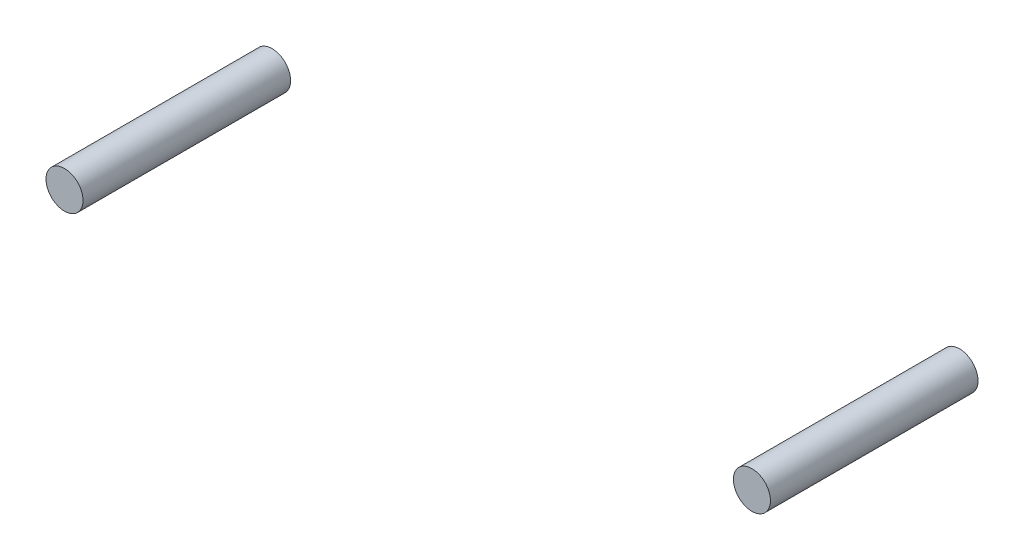
ISO-10303-21;
HEADER;
FILE_DESCRIPTION(('STEP AP214'),'2;1');
FILE_NAME('part.step','',(''),(''),'','','');
FILE_SCHEMA(('AUTOMOTIVE_DESIGN { 1 0 10303 214 1 1 1 1 }'));
ENDSEC;
DATA;
#1=APPLICATION_CONTEXT('core data for automotive mechanical design processes');
#2=APPLICATION_PROTOCOL_DEFINITION('international standard','automotive_design',2000,#1);
#3=PRODUCT_CONTEXT('',#1,'mechanical');
#4=PRODUCT('Part','Part','',(#3));
#5=PRODUCT_RELATED_PRODUCT_CATEGORY('part','',(#4));
#6=PRODUCT_DEFINITION_FORMATION('','',#4);
#7=PRODUCT_DEFINITION_CONTEXT('part definition',#1,'design');
#8=PRODUCT_DEFINITION('design','',#6,#7);
#9=PRODUCT_DEFINITION_SHAPE('','',#8);
#10=(LENGTH_UNIT() NAMED_UNIT(*) SI_UNIT(.MILLI.,.METRE.));
#11=(NAMED_UNIT(*) PLANE_ANGLE_UNIT() SI_UNIT($,.RADIAN.));
#12=(NAMED_UNIT(*) SI_UNIT($,.STERADIAN.) SOLID_ANGLE_UNIT());
#13=UNCERTAINTY_MEASURE_WITH_UNIT(LENGTH_MEASURE(1.E-05),#10,'distance_accuracy_value','');
#14=(GEOMETRIC_REPRESENTATION_CONTEXT(3) GLOBAL_UNCERTAINTY_ASSIGNED_CONTEXT((#13)) GLOBAL_UNIT_ASSIGNED_CONTEXT((#10,
#11,#12)) REPRESENTATION_CONTEXT('',''));
#15=CARTESIAN_POINT('',(0.,0.,0.));
#16=DIRECTION('',(0.,0.,1.));
#17=DIRECTION('',(1.,0.,0.));
#18=AXIS2_PLACEMENT_3D('',#15,#16,#17);
#19=CARTESIAN_POINT('',(0.,0.,48.2981000000003));
#20=DIRECTION('',(0.,0.,1.));
#21=DIRECTION('',(1.,0.,0.));
#22=AXIS2_PLACEMENT_3D('',#19,#20,#21);
#23=PLANE('',#22);
#24=CARTESIAN_POINT('',(-2.36061170610924E-13,-1.04014019619569E-13,48.2981000000003));
#25=DIRECTION('',(0.,0.,1.));
#26=DIRECTION('',(1.,0.,0.));
#27=AXIS2_PLACEMENT_3D('',#24,#25,#26);
#28=CIRCLE('',#27,6.35);
#29=CARTESIAN_POINT('',(6.34999999999976,-1.04014019619569E-13,48.2981000000003));
#30=VERTEX_POINT('',#29);
#31=EDGE_CURVE('E11',#30,#30,#28,.F.);
#32=ORIENTED_EDGE('',*,*,#31,.F.);
#33=EDGE_LOOP('',(#32));
#34=FACE_BOUND('',#33,.T.);
#35=ADVANCED_FACE('F44',(#34),#23,.T.);
#36=CARTESIAN_POINT('',(-1.97182548067331E-13,-1.23453330891366E-13,-22.86));
#37=DIRECTION('',(0.,0.,-1.));
#38=DIRECTION('',(-1.,0.,0.));
#39=AXIS2_PLACEMENT_3D('',#36,#37,#38);
#40=PLANE('',#39);
#41=CARTESIAN_POINT('',(-1.97182548067331E-13,-1.23453330891366E-13,-22.86));
#42=DIRECTION('',(0.,0.,-1.));
#43=DIRECTION('',(-1.,0.,0.));
#44=AXIS2_PLACEMENT_3D('',#41,#42,#43);
#45=CIRCLE('',#44,6.35);
#46=CARTESIAN_POINT('',(-6.3500000000002,-1.23453330891366E-13,-22.86));
#47=VERTEX_POINT('',#46);
#48=EDGE_CURVE('E50',#47,#47,#45,.T.);
#49=ORIENTED_EDGE('',*,*,#48,.T.);
#50=EDGE_LOOP('',(#49));
#51=FACE_BOUND('',#50,.T.);
#52=ADVANCED_FACE('F56',(#51),#40,.T.);
#53=CARTESIAN_POINT('',(-2.45874248477698E-13,0.,66.2586122421387));
#54=DIRECTION('',(0.,0.,-1.));
#55=DIRECTION('',(-1.,0.,0.));
#56=AXIS2_PLACEMENT_3D('',#53,#54,#55);
#57=CYLINDRICAL_SURFACE('',#56,6.35);
#58=ORIENTED_EDGE('',*,*,#48,.F.);
#59=EDGE_LOOP('',(#58));
#60=FACE_BOUND('',#59,.T.);
#61=ORIENTED_EDGE('',*,*,#31,.T.);
#62=EDGE_LOOP('',(#61));
#63=FACE_BOUND('',#62,.T.);
#64=ADVANCED_FACE('F58',(#60,#63),#57,.T.);
#65=CLOSED_SHELL('',(#35,#52,#64));
#66=MANIFOLD_SOLID_BREP('B2',#65);
#67=CARTESIAN_POINT('',(0.,0.,48.2981000000003));
#68=DIRECTION('',(0.,0.,1.));
#69=DIRECTION('',(1.,0.,0.));
#70=AXIS2_PLACEMENT_3D('',#67,#68,#69);
#71=PLANE('',#70);
#72=CARTESIAN_POINT('',(-235.644133072459,-28.715891478924,48.2981000000003));
#73=DIRECTION('',(0.,0.,1.));
#74=DIRECTION('',(1.,0.,0.));
#75=AXIS2_PLACEMENT_3D('',#72,#73,#74);
#76=CIRCLE('',#75,6.35);
#77=CARTESIAN_POINT('',(-229.294133072459,-28.715891478924,48.2981000000003));
#78=VERTEX_POINT('',#77);
#79=EDGE_CURVE('E43',#78,#78,#76,.F.);
#80=ORIENTED_EDGE('',*,*,#79,.F.);
#81=EDGE_LOOP('',(#80));
#82=FACE_BOUND('',#81,.T.);
#83=ADVANCED_FACE('F93',(#82),#71,.T.);
#84=CARTESIAN_POINT('',(-235.644133072459,-28.715891478924,-22.8600000000001));
#85=DIRECTION('',(0.,0.,-1.));
#86=DIRECTION('',(-1.,0.,0.));
#87=AXIS2_PLACEMENT_3D('',#84,#85,#86);
#88=PLANE('',#87);
#89=CARTESIAN_POINT('',(-235.644133072459,-28.715891478924,-22.8600000000001));
#90=DIRECTION('',(0.,0.,-1.));
#91=DIRECTION('',(-1.,0.,0.));
#92=AXIS2_PLACEMENT_3D('',#89,#90,#91);
#93=CIRCLE('',#92,6.35);
#94=CARTESIAN_POINT('',(-241.994133072459,-28.715891478924,-22.8600000000001));
#95=VERTEX_POINT('',#94);
#96=EDGE_CURVE('E99',#95,#95,#93,.T.);
#97=ORIENTED_EDGE('',*,*,#96,.T.);
#98=EDGE_LOOP('',(#97));
#99=FACE_BOUND('',#98,.T.);
#100=ADVANCED_FACE('F105',(#99),#88,.T.);
#101=CARTESIAN_POINT('',(-235.644133072459,-28.715891478924,66.2586122421386));
#102=DIRECTION('',(0.,0.,-1.));
#103=DIRECTION('',(-1.,0.,0.));
#104=AXIS2_PLACEMENT_3D('',#101,#102,#103);
#105=CYLINDRICAL_SURFACE('',#104,6.35);
#106=ORIENTED_EDGE('',*,*,#96,.F.);
#107=EDGE_LOOP('',(#106));
#108=FACE_BOUND('',#107,.T.);
#109=ORIENTED_EDGE('',*,*,#79,.T.);
#110=EDGE_LOOP('',(#109));
#111=FACE_BOUND('',#110,.T.);
#112=ADVANCED_FACE('F107',(#108,#111),#105,.T.);
#113=CLOSED_SHELL('',(#83,#100,#112));
#114=MANIFOLD_SOLID_BREP('B6',#113);
#115=ADVANCED_BREP_SHAPE_REPRESENTATION('',(#18,#66,#114),#14);
#116=SHAPE_DEFINITION_REPRESENTATION(#9,#115);
ENDSEC;
END-ISO-10303-21;
